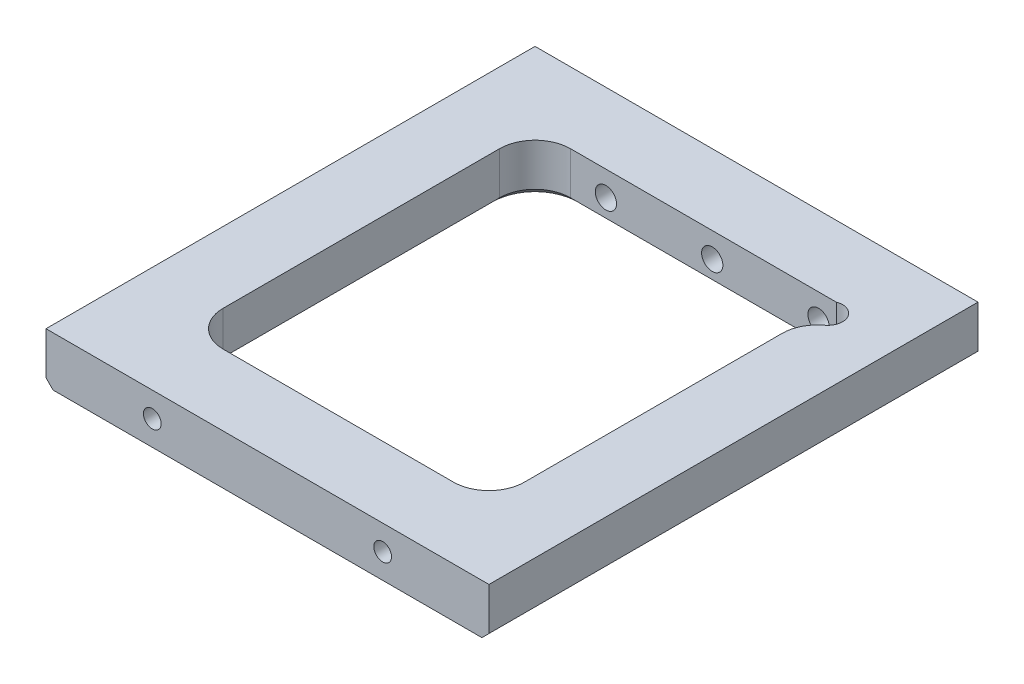
ISO-10303-21;
HEADER;
FILE_DESCRIPTION(('STEP AP214'),'2;1');
FILE_NAME('part.step','',(''),(''),'','','');
FILE_SCHEMA(('AUTOMOTIVE_DESIGN { 1 0 10303 214 1 1 1 1 }'));
ENDSEC;
DATA;
#1=APPLICATION_CONTEXT('core data for automotive mechanical design processes');
#2=APPLICATION_PROTOCOL_DEFINITION('international standard','automotive_design',2000,#1);
#3=PRODUCT_CONTEXT('',#1,'mechanical');
#4=PRODUCT('Part','Part','',(#3));
#5=PRODUCT_RELATED_PRODUCT_CATEGORY('part','',(#4));
#6=PRODUCT_DEFINITION_FORMATION('','',#4);
#7=PRODUCT_DEFINITION_CONTEXT('part definition',#1,'design');
#8=PRODUCT_DEFINITION('design','',#6,#7);
#9=PRODUCT_DEFINITION_SHAPE('','',#8);
#10=(LENGTH_UNIT() NAMED_UNIT(*) SI_UNIT(.MILLI.,.METRE.));
#11=(NAMED_UNIT(*) PLANE_ANGLE_UNIT() SI_UNIT($,.RADIAN.));
#12=(NAMED_UNIT(*) SI_UNIT($,.STERADIAN.) SOLID_ANGLE_UNIT());
#13=UNCERTAINTY_MEASURE_WITH_UNIT(LENGTH_MEASURE(1.E-05),#10,'distance_accuracy_value','');
#14=(GEOMETRIC_REPRESENTATION_CONTEXT(3) GLOBAL_UNCERTAINTY_ASSIGNED_CONTEXT((#13)) GLOBAL_UNIT_ASSIGNED_CONTEXT((#10,
#11,#12)) REPRESENTATION_CONTEXT('',''));
#15=CARTESIAN_POINT('',(0.,0.,0.));
#16=DIRECTION('',(0.,0.,1.));
#17=DIRECTION('',(1.,0.,0.));
#18=AXIS2_PLACEMENT_3D('',#15,#16,#17);
#19=CARTESIAN_POINT('',(0.,0.,0.));
#20=DIRECTION('',(0.,0.,-1.));
#21=DIRECTION('',(-1.,0.,0.));
#22=AXIS2_PLACEMENT_3D('',#19,#20,#21);
#23=PLANE('',#22);
#24=CARTESIAN_POINT('',(-25.,200.,0.));
#25=DIRECTION('',(0.,0.,-1.));
#26=DIRECTION('',(-1.,0.,0.));
#27=AXIS2_PLACEMENT_3D('',#24,#25,#26);
#28=CIRCLE('',#27,2.99999999999999);
#29=CARTESIAN_POINT('',(-28.,200.,0.));
#30=VERTEX_POINT('',#29);
#31=EDGE_CURVE('E405',#30,#30,#28,.T.);
#32=ORIENTED_EDGE('',*,*,#31,.F.);
#33=EDGE_LOOP('',(#32));
#34=FACE_BOUND('',#33,.T.);
#35=CARTESIAN_POINT('',(-55.,200.,0.));
#36=DIRECTION('',(0.,0.,-1.));
#37=DIRECTION('',(-1.,0.,0.));
#38=AXIS2_PLACEMENT_3D('',#35,#36,#37);
#39=CIRCLE('',#38,3.);
#40=CARTESIAN_POINT('',(-58.,200.,0.));
#41=VERTEX_POINT('',#40);
#42=EDGE_CURVE('E411',#41,#41,#39,.T.);
#43=ORIENTED_EDGE('',*,*,#42,.F.);
#44=EDGE_LOOP('',(#43));
#45=FACE_BOUND('',#44,.T.);
#46=CARTESIAN_POINT('',(-85.,200.,0.));
#47=DIRECTION('',(0.,0.,-1.));
#48=DIRECTION('',(-1.,0.,0.));
#49=AXIS2_PLACEMENT_3D('',#46,#47,#48);
#50=CIRCLE('',#49,3.);
#51=CARTESIAN_POINT('',(-88.,200.,0.));
#52=VERTEX_POINT('',#51);
#53=EDGE_CURVE('E417',#52,#52,#50,.T.);
#54=ORIENTED_EDGE('',*,*,#53,.F.);
#55=EDGE_LOOP('',(#54));
#56=FACE_BOUND('',#55,.T.);
#57=DIRECTION('',(0.,1.,0.));
#58=VECTOR('',#57,1.);
#59=CARTESIAN_POINT('',(0.,207.,0.));
#60=LINE('',#59,#58);
#61=CARTESIAN_POINT('',(0.,195.,0.));
#62=VERTEX_POINT('',#61);
#63=CARTESIAN_POINT('',(0.,207.,0.));
#64=VERTEX_POINT('',#63);
#65=EDGE_CURVE('E245',#62,#64,#60,.T.);
#66=ORIENTED_EDGE('',*,*,#65,.F.);
#67=DIRECTION('',(0.707106781186543,0.707106781186552,0.));
#68=VECTOR('',#67,1.);
#69=CARTESIAN_POINT('',(-97.5,97.4999999999986,0.));
#70=LINE('',#69,#68);
#71=CARTESIAN_POINT('',(-2.,193.,0.));
#72=VERTEX_POINT('',#71);
#73=EDGE_CURVE('E530',#62,#72,#70,.F.);
#74=ORIENTED_EDGE('',*,*,#73,.T.);
#75=DIRECTION('',(1.,0.,0.));
#76=VECTOR('',#75,1.);
#77=CARTESIAN_POINT('',(-125.,193.,0.));
#78=LINE('',#77,#76);
#79=CARTESIAN_POINT('',(-123.,193.,0.));
#80=VERTEX_POINT('',#79);
#81=EDGE_CURVE('E241',#80,#72,#78,.T.);
#82=ORIENTED_EDGE('',*,*,#81,.F.);
#83=DIRECTION('',(0.707106781186548,-0.707106781186548,0.));
#84=VECTOR('',#83,1.);
#85=CARTESIAN_POINT('',(35.,35.,0.));
#86=LINE('',#85,#84);
#87=CARTESIAN_POINT('',(-125.,195.,0.));
#88=VERTEX_POINT('',#87);
#89=EDGE_CURVE('E533',#80,#88,#86,.F.);
#90=ORIENTED_EDGE('',*,*,#89,.T.);
#91=DIRECTION('',(0.,-1.,0.));
#92=VECTOR('',#91,1.);
#93=CARTESIAN_POINT('',(-125.,197.5,0.));
#94=LINE('',#93,#92);
#95=CARTESIAN_POINT('',(-125.,207.,0.));
#96=VERTEX_POINT('',#95);
#97=EDGE_CURVE('E238',#96,#88,#94,.T.);
#98=ORIENTED_EDGE('',*,*,#97,.F.);
#99=DIRECTION('',(-1.,0.,0.));
#100=VECTOR('',#99,1.);
#101=CARTESIAN_POINT('',(-125.,207.,0.));
#102=LINE('',#101,#100);
#103=EDGE_CURVE('E247',#64,#96,#102,.T.);
#104=ORIENTED_EDGE('',*,*,#103,.F.);
#105=EDGE_LOOP('',(#66,#74,#82,#90,#98,#104));
#106=FACE_BOUND('',#105,.T.);
#107=ADVANCED_FACE('F43',(#34,#45,#56,#106),#23,.T.);
#108=CARTESIAN_POINT('',(-125.,207.,275.781556676645));
#109=DIRECTION('',(0.,-1.,0.));
#110=DIRECTION('',(0.,0.,-1.));
#111=AXIS2_PLACEMENT_3D('',#108,#109,#110);
#112=PLANE('',#111);
#113=CARTESIAN_POINT('',(-18.5,207.,23.9226312627786));
#114=DIRECTION('',(0.,1.,0.));
#115=DIRECTION('',(0.,0.,1.));
#116=AXIS2_PLACEMENT_3D('',#113,#114,#115);
#117=CIRCLE('',#116,4.19964713085852);
#118=CARTESIAN_POINT('',(-15.9860642462923,207.,27.2867304066741));
#119=VERTEX_POINT('',#118);
#120=CARTESIAN_POINT('',(-20.,207.,20.));
#121=VERTEX_POINT('',#120);
#122=EDGE_CURVE('E423',#119,#121,#117,.T.);
#123=ORIENTED_EDGE('',*,*,#122,.F.);
#124=CARTESIAN_POINT('',(-9.99999999999996,207.,35.2971632813233));
#125=DIRECTION('',(0.,-1.,0.));
#126=DIRECTION('',(0.,0.,-1.));
#127=AXIS2_PLACEMENT_3D('',#124,#125,#126);
#128=CIRCLE('',#127,10.);
#129=CARTESIAN_POINT('',(-20.,207.,35.2971632813233));
#130=VERTEX_POINT('',#129);
#131=EDGE_CURVE('E420',#130,#119,#128,.T.);
#132=ORIENTED_EDGE('',*,*,#131,.F.);
#133=DIRECTION('',(0.,0.,-1.));
#134=VECTOR('',#133,1.);
#135=CARTESIAN_POINT('',(-20.,207.,108.));
#136=LINE('',#135,#134);
#137=CARTESIAN_POINT('',(-20.,207.,108.));
#138=VERTEX_POINT('',#137);
#139=EDGE_CURVE('E228',#138,#130,#136,.T.);
#140=ORIENTED_EDGE('',*,*,#139,.F.);
#141=CARTESIAN_POINT('',(-30.,207.,108.));
#142=DIRECTION('',(0.,1.,0.));
#143=DIRECTION('',(0.,0.,1.));
#144=AXIS2_PLACEMENT_3D('',#141,#142,#143);
#145=CIRCLE('',#144,10.);
#146=CARTESIAN_POINT('',(-30.,207.,118.));
#147=VERTEX_POINT('',#146);
#148=EDGE_CURVE('E438',#147,#138,#145,.T.);
#149=ORIENTED_EDGE('',*,*,#148,.F.);
#150=DIRECTION('',(1.,0.,0.));
#151=VECTOR('',#150,1.);
#152=CARTESIAN_POINT('',(-95.,207.,118.));
#153=LINE('',#152,#151);
#154=CARTESIAN_POINT('',(-95.,207.,118.));
#155=VERTEX_POINT('',#154);
#156=EDGE_CURVE('E436',#155,#147,#153,.T.);
#157=ORIENTED_EDGE('',*,*,#156,.F.);
#158=CARTESIAN_POINT('',(-95.,207.,108.));
#159=DIRECTION('',(0.,1.,0.));
#160=DIRECTION('',(0.,0.,1.));
#161=AXIS2_PLACEMENT_3D('',#158,#159,#160);
#162=CIRCLE('',#161,9.99999999999999);
#163=CARTESIAN_POINT('',(-105.,207.,108.));
#164=VERTEX_POINT('',#163);
#165=EDGE_CURVE('E210',#164,#155,#162,.T.);
#166=ORIENTED_EDGE('',*,*,#165,.F.);
#167=DIRECTION('',(0.,0.,1.));
#168=VECTOR('',#167,1.);
#169=CARTESIAN_POINT('',(-105.,207.,30.0000000000001));
#170=LINE('',#169,#168);
#171=CARTESIAN_POINT('',(-105.,207.,30.0000000000001));
#172=VERTEX_POINT('',#171);
#173=EDGE_CURVE('E432',#172,#164,#170,.T.);
#174=ORIENTED_EDGE('',*,*,#173,.F.);
#175=CARTESIAN_POINT('',(-95.,207.,30.));
#176=DIRECTION('',(0.,1.,0.));
#177=DIRECTION('',(0.,0.,1.));
#178=AXIS2_PLACEMENT_3D('',#175,#176,#177);
#179=CIRCLE('',#178,10.);
#180=CARTESIAN_POINT('',(-94.9999999999999,207.,20.));
#181=VERTEX_POINT('',#180);
#182=EDGE_CURVE('E429',#181,#172,#179,.T.);
#183=ORIENTED_EDGE('',*,*,#182,.F.);
#184=DIRECTION('',(-1.,0.,0.));
#185=VECTOR('',#184,1.);
#186=CARTESIAN_POINT('',(-20.,207.,20.));
#187=LINE('',#186,#185);
#188=EDGE_CURVE('E426',#121,#181,#187,.T.);
#189=ORIENTED_EDGE('',*,*,#188,.F.);
#190=EDGE_LOOP('',(#123,#132,#140,#149,#157,#166,#174,#183,#189));
#191=FACE_BOUND('',#190,.T.);
#192=DIRECTION('',(0.,0.,-1.));
#193=VECTOR('',#192,1.);
#194=CARTESIAN_POINT('',(-125.,207.,275.781556676645));
#195=LINE('',#194,#193);
#196=CARTESIAN_POINT('',(-125.,207.,138.));
#197=VERTEX_POINT('',#196);
#198=EDGE_CURVE('E250',#197,#96,#195,.T.);
#199=ORIENTED_EDGE('',*,*,#198,.F.);
#200=DIRECTION('',(1.,0.,0.));
#201=VECTOR('',#200,1.);
#202=CARTESIAN_POINT('',(-125.,207.,138.));
#203=LINE('',#202,#201);
#204=CARTESIAN_POINT('',(0.,207.,138.));
#205=VERTEX_POINT('',#204);
#206=EDGE_CURVE('E233',#197,#205,#203,.T.);
#207=ORIENTED_EDGE('',*,*,#206,.T.);
#208=DIRECTION('',(0.,0.,-1.));
#209=VECTOR('',#208,1.);
#210=CARTESIAN_POINT('',(0.,207.,275.781556676645));
#211=LINE('',#210,#209);
#212=EDGE_CURVE('E252',#205,#64,#211,.T.);
#213=ORIENTED_EDGE('',*,*,#212,.T.);
#214=ORIENTED_EDGE('',*,*,#103,.T.);
#215=EDGE_LOOP('',(#199,#207,#213,#214));
#216=FACE_BOUND('',#215,.T.);
#217=ADVANCED_FACE('F307',(#191,#216),#112,.F.);
#218=CARTESIAN_POINT('',(0.,207.,275.781556676645));
#219=DIRECTION('',(-1.,0.,0.));
#220=DIRECTION('',(0.,0.,1.));
#221=AXIS2_PLACEMENT_3D('',#218,#219,#220);
#222=PLANE('',#221);
#223=DIRECTION('',(0.,-1.,0.));
#224=VECTOR('',#223,1.);
#225=CARTESIAN_POINT('',(0.,207.,138.));
#226=LINE('',#225,#224);
#227=CARTESIAN_POINT('',(0.,195.,138.));
#228=VERTEX_POINT('',#227);
#229=EDGE_CURVE('E229',#205,#228,#226,.T.);
#230=ORIENTED_EDGE('',*,*,#229,.T.);
#231=DIRECTION('',(0.,0.,-1.));
#232=VECTOR('',#231,1.);
#233=CARTESIAN_POINT('',(0.,195.,275.781556676645));
#234=LINE('',#233,#232);
#235=EDGE_CURVE('E195',#228,#62,#234,.T.);
#236=ORIENTED_EDGE('',*,*,#235,.T.);
#237=ORIENTED_EDGE('',*,*,#65,.T.);
#238=ORIENTED_EDGE('',*,*,#212,.F.);
#239=EDGE_LOOP('',(#230,#236,#237,#238));
#240=FACE_BOUND('',#239,.T.);
#241=ADVANCED_FACE('F313',(#240),#222,.F.);
#242=CARTESIAN_POINT('',(-125.,193.,275.781556676645));
#243=DIRECTION('',(0.,1.,0.));
#244=DIRECTION('',(0.,0.,1.));
#245=AXIS2_PLACEMENT_3D('',#242,#243,#244);
#246=PLANE('',#245);
#247=CARTESIAN_POINT('',(-9.99999999999996,193.,35.2971632813233));
#248=DIRECTION('',(0.,1.,0.));
#249=DIRECTION('',(0.,0.,1.));
#250=AXIS2_PLACEMENT_3D('',#247,#248,#249);
#251=CIRCLE('',#250,8.);
#252=CARTESIAN_POINT('',(-18.,193.,35.2971632813233));
#253=VERTEX_POINT('',#252);
#254=CARTESIAN_POINT('',(-14.7888513970338,193.,28.888816981604));
#255=VERTEX_POINT('',#254);
#256=EDGE_CURVE('E467',#253,#255,#251,.F.);
#257=ORIENTED_EDGE('',*,*,#256,.T.);
#258=CARTESIAN_POINT('',(-18.5,193.,23.9226312627786));
#259=DIRECTION('',(0.,1.,0.));
#260=DIRECTION('',(0.,0.,1.));
#261=AXIS2_PLACEMENT_3D('',#258,#259,#260);
#262=CIRCLE('',#261,6.19964713085853);
#263=CARTESIAN_POINT('',(-20.3325019706182,193.,18.));
#264=VERTEX_POINT('',#263);
#265=EDGE_CURVE('E470',#255,#264,#262,.T.);
#266=ORIENTED_EDGE('',*,*,#265,.T.);
#267=DIRECTION('',(-1.,0.,0.));
#268=VECTOR('',#267,1.);
#269=CARTESIAN_POINT('',(-125.,193.,18.));
#270=LINE('',#269,#268);
#271=CARTESIAN_POINT('',(-94.9999999999999,193.,18.));
#272=VERTEX_POINT('',#271);
#273=EDGE_CURVE('E516',#264,#272,#270,.T.);
#274=ORIENTED_EDGE('',*,*,#273,.T.);
#275=CARTESIAN_POINT('',(-95.,193.,30.));
#276=DIRECTION('',(0.,1.,0.));
#277=DIRECTION('',(0.,0.,1.));
#278=AXIS2_PLACEMENT_3D('',#275,#276,#277);
#279=CIRCLE('',#278,12.);
#280=CARTESIAN_POINT('',(-107.,193.,30.0000000000001));
#281=VERTEX_POINT('',#280);
#282=EDGE_CURVE('E513',#272,#281,#279,.T.);
#283=ORIENTED_EDGE('',*,*,#282,.T.);
#284=DIRECTION('',(0.,0.,1.));
#285=VECTOR('',#284,1.);
#286=CARTESIAN_POINT('',(-107.,193.,275.781556676645));
#287=LINE('',#286,#285);
#288=CARTESIAN_POINT('',(-107.,193.,108.));
#289=VERTEX_POINT('',#288);
#290=EDGE_CURVE('E529',#281,#289,#287,.T.);
#291=ORIENTED_EDGE('',*,*,#290,.T.);
#292=CARTESIAN_POINT('',(-95.,193.,108.));
#293=DIRECTION('',(0.,1.,0.));
#294=DIRECTION('',(0.,0.,1.));
#295=AXIS2_PLACEMENT_3D('',#292,#293,#294);
#296=CIRCLE('',#295,12.);
#297=CARTESIAN_POINT('',(-95.,193.,120.));
#298=VERTEX_POINT('',#297);
#299=EDGE_CURVE('E525',#289,#298,#296,.T.);
#300=ORIENTED_EDGE('',*,*,#299,.T.);
#301=DIRECTION('',(1.,0.,0.));
#302=VECTOR('',#301,1.);
#303=CARTESIAN_POINT('',(-125.,193.,120.));
#304=LINE('',#303,#302);
#305=CARTESIAN_POINT('',(-30.,193.,120.));
#306=VERTEX_POINT('',#305);
#307=EDGE_CURVE('E538',#298,#306,#304,.T.);
#308=ORIENTED_EDGE('',*,*,#307,.T.);
#309=CARTESIAN_POINT('',(-30.,193.,108.));
#310=DIRECTION('',(0.,1.,0.));
#311=DIRECTION('',(0.,0.,1.));
#312=AXIS2_PLACEMENT_3D('',#309,#310,#311);
#313=CIRCLE('',#312,12.);
#314=CARTESIAN_POINT('',(-18.,193.,108.));
#315=VERTEX_POINT('',#314);
#316=EDGE_CURVE('E475',#306,#315,#313,.T.);
#317=ORIENTED_EDGE('',*,*,#316,.T.);
#318=DIRECTION('',(0.,0.,-1.));
#319=VECTOR('',#318,1.);
#320=CARTESIAN_POINT('',(-18.0000000000001,193.,275.781556676645));
#321=LINE('',#320,#319);
#322=EDGE_CURVE('E471',#315,#253,#321,.T.);
#323=ORIENTED_EDGE('',*,*,#322,.T.);
#324=EDGE_LOOP('',(#257,#266,#274,#283,#291,#300,#308,#317,#323));
#325=FACE_BOUND('',#324,.T.);
#326=ORIENTED_EDGE('',*,*,#81,.T.);
#327=DIRECTION('',(0.,0.,1.));
#328=VECTOR('',#327,1.);
#329=CARTESIAN_POINT('',(-2.,193.,275.781556676645));
#330=LINE('',#329,#328);
#331=CARTESIAN_POINT('',(-2.,193.,138.));
#332=VERTEX_POINT('',#331);
#333=EDGE_CURVE('E481',#72,#332,#330,.T.);
#334=ORIENTED_EDGE('',*,*,#333,.T.);
#335=DIRECTION('',(-1.,0.,0.));
#336=VECTOR('',#335,1.);
#337=CARTESIAN_POINT('',(-125.,193.,138.));
#338=LINE('',#337,#336);
#339=CARTESIAN_POINT('',(-123.,193.,138.));
#340=VERTEX_POINT('',#339);
#341=EDGE_CURVE('E232',#332,#340,#338,.T.);
#342=ORIENTED_EDGE('',*,*,#341,.T.);
#343=DIRECTION('',(0.,0.,-1.));
#344=VECTOR('',#343,1.);
#345=CARTESIAN_POINT('',(-123.,193.,275.781556676645));
#346=LINE('',#345,#344);
#347=EDGE_CURVE('E473',#340,#80,#346,.T.);
#348=ORIENTED_EDGE('',*,*,#347,.T.);
#349=EDGE_LOOP('',(#326,#334,#342,#348));
#350=FACE_BOUND('',#349,.T.);
#351=ADVANCED_FACE('F322',(#325,#350),#246,.F.);
#352=CARTESIAN_POINT('',(-125.,197.5,275.781556676645));
#353=DIRECTION('',(1.,0.,0.));
#354=DIRECTION('',(0.,0.,-1.));
#355=AXIS2_PLACEMENT_3D('',#352,#353,#354);
#356=PLANE('',#355);
#357=ORIENTED_EDGE('',*,*,#97,.T.);
#358=DIRECTION('',(0.,0.,1.));
#359=VECTOR('',#358,1.);
#360=CARTESIAN_POINT('',(-125.,195.,275.781556676645));
#361=LINE('',#360,#359);
#362=CARTESIAN_POINT('',(-125.,195.,138.));
#363=VERTEX_POINT('',#362);
#364=EDGE_CURVE('E487',#88,#363,#361,.T.);
#365=ORIENTED_EDGE('',*,*,#364,.T.);
#366=DIRECTION('',(0.,1.,0.));
#367=VECTOR('',#366,1.);
#368=CARTESIAN_POINT('',(-125.,197.5,138.));
#369=LINE('',#368,#367);
#370=EDGE_CURVE('E236',#363,#197,#369,.T.);
#371=ORIENTED_EDGE('',*,*,#370,.T.);
#372=ORIENTED_EDGE('',*,*,#198,.T.);
#373=EDGE_LOOP('',(#357,#365,#371,#372));
#374=FACE_BOUND('',#373,.T.);
#375=ADVANCED_FACE('F326',(#374),#356,.F.);
#376=CARTESIAN_POINT('',(-128.661507045978,58.9999999719022,138.));
#377=DIRECTION('',(0.,0.,-1.));
#378=DIRECTION('',(0.,-1.,0.));
#379=AXIS2_PLACEMENT_3D('',#376,#377,#378);
#380=PLANE('',#379);
#381=CARTESIAN_POINT('',(-95.,200.,138.));
#382=DIRECTION('',(0.,0.,1.));
#383=DIRECTION('',(1.,0.,0.));
#384=AXIS2_PLACEMENT_3D('',#381,#382,#383);
#385=CIRCLE('',#384,2.49999999999999);
#386=CARTESIAN_POINT('',(-92.5,200.,138.));
#387=VERTEX_POINT('',#386);
#388=EDGE_CURVE('E206',#387,#387,#385,.T.);
#389=ORIENTED_EDGE('',*,*,#388,.F.);
#390=EDGE_LOOP('',(#389));
#391=FACE_BOUND('',#390,.T.);
#392=CARTESIAN_POINT('',(-30.,200.,138.));
#393=DIRECTION('',(0.,0.,1.));
#394=DIRECTION('',(1.,0.,0.));
#395=AXIS2_PLACEMENT_3D('',#392,#393,#394);
#396=CIRCLE('',#395,2.49999999999999);
#397=CARTESIAN_POINT('',(-27.5,200.,138.));
#398=VERTEX_POINT('',#397);
#399=EDGE_CURVE('E205',#398,#398,#396,.T.);
#400=ORIENTED_EDGE('',*,*,#399,.F.);
#401=EDGE_LOOP('',(#400));
#402=FACE_BOUND('',#401,.T.);
#403=ORIENTED_EDGE('',*,*,#341,.F.);
#404=DIRECTION('',(-0.707106781186543,-0.707106781186552,0.));
#405=VECTOR('',#404,1.);
#406=CARTESIAN_POINT('',(0.,195.,138.));
#407=LINE('',#406,#405);
#408=EDGE_CURVE('E485',#332,#228,#407,.F.);
#409=ORIENTED_EDGE('',*,*,#408,.T.);
#410=ORIENTED_EDGE('',*,*,#229,.F.);
#411=ORIENTED_EDGE('',*,*,#206,.F.);
#412=ORIENTED_EDGE('',*,*,#370,.F.);
#413=DIRECTION('',(-0.707106781186548,0.707106781186548,0.));
#414=VECTOR('',#413,1.);
#415=CARTESIAN_POINT('',(-123.,193.,138.));
#416=LINE('',#415,#414);
#417=EDGE_CURVE('E483',#363,#340,#416,.F.);
#418=ORIENTED_EDGE('',*,*,#417,.T.);
#419=EDGE_LOOP('',(#403,#409,#410,#411,#412,#418));
#420=FACE_BOUND('',#419,.T.);
#421=ADVANCED_FACE('F302',(#391,#402,#420),#380,.F.);
#422=CARTESIAN_POINT('',(-9.99999999999996,193.,35.2971632813233));
#423=DIRECTION('',(0.,1.,0.));
#424=DIRECTION('',(0.,0.,1.));
#425=AXIS2_PLACEMENT_3D('',#422,#423,#424);
#426=CYLINDRICAL_SURFACE('',#425,10.);
#427=DIRECTION('',(0.,1.,0.));
#428=VECTOR('',#427,1.);
#429=CARTESIAN_POINT('',(-15.9860642462923,193.,27.2867304066741));
#430=LINE('',#429,#428);
#431=CARTESIAN_POINT('',(-15.9860642462923,195.,27.2867304066741));
#432=VERTEX_POINT('',#431);
#433=EDGE_CURVE('E226',#432,#119,#430,.T.);
#434=ORIENTED_EDGE('',*,*,#433,.F.);
#435=CARTESIAN_POINT('',(-9.99999999999996,195.,35.2971632813233));
#436=DIRECTION('',(0.,1.,0.));
#437=DIRECTION('',(0.,0.,1.));
#438=AXIS2_PLACEMENT_3D('',#435,#436,#437);
#439=CIRCLE('',#438,10.);
#440=CARTESIAN_POINT('',(-20.,195.,35.2971632813233));
#441=VERTEX_POINT('',#440);
#442=EDGE_CURVE('E461',#432,#441,#439,.T.);
#443=ORIENTED_EDGE('',*,*,#442,.T.);
#444=DIRECTION('',(0.,1.,0.));
#445=VECTOR('',#444,1.);
#446=CARTESIAN_POINT('',(-20.,193.,35.2971632813233));
#447=LINE('',#446,#445);
#448=EDGE_CURVE('E242',#441,#130,#447,.T.);
#449=ORIENTED_EDGE('',*,*,#448,.T.);
#450=ORIENTED_EDGE('',*,*,#131,.T.);
#451=EDGE_LOOP('',(#434,#443,#449,#450));
#452=FACE_BOUND('',#451,.T.);
#453=ADVANCED_FACE('F295',(#452),#426,.T.);
#454=CARTESIAN_POINT('',(-20.,193.,108.));
#455=DIRECTION('',(1.,0.,0.));
#456=DIRECTION('',(0.,0.,-1.));
#457=AXIS2_PLACEMENT_3D('',#454,#455,#456);
#458=PLANE('',#457);
#459=ORIENTED_EDGE('',*,*,#448,.F.);
#460=DIRECTION('',(0.,0.,1.));
#461=VECTOR('',#460,1.);
#462=CARTESIAN_POINT('',(-20.,195.,108.));
#463=LINE('',#462,#461);
#464=CARTESIAN_POINT('',(-20.,195.,108.));
#465=VERTEX_POINT('',#464);
#466=EDGE_CURVE('E453',#441,#465,#463,.T.);
#467=ORIENTED_EDGE('',*,*,#466,.T.);
#468=DIRECTION('',(0.,1.,0.));
#469=VECTOR('',#468,1.);
#470=CARTESIAN_POINT('',(-20.,193.,108.));
#471=LINE('',#470,#469);
#472=EDGE_CURVE('E443',#465,#138,#471,.T.);
#473=ORIENTED_EDGE('',*,*,#472,.T.);
#474=ORIENTED_EDGE('',*,*,#139,.T.);
#475=EDGE_LOOP('',(#459,#467,#473,#474));
#476=FACE_BOUND('',#475,.T.);
#477=ADVANCED_FACE('F293',(#476),#458,.F.);
#478=CARTESIAN_POINT('',(-30.,193.,108.));
#479=DIRECTION('',(0.,1.,0.));
#480=DIRECTION('',(0.,0.,1.));
#481=AXIS2_PLACEMENT_3D('',#478,#479,#480);
#482=CYLINDRICAL_SURFACE('',#481,10.);
#483=ORIENTED_EDGE('',*,*,#472,.F.);
#484=CARTESIAN_POINT('',(-30.,195.,108.));
#485=DIRECTION('',(0.,1.,0.));
#486=DIRECTION('',(0.,0.,1.));
#487=AXIS2_PLACEMENT_3D('',#484,#485,#486);
#488=CIRCLE('',#487,10.);
#489=CARTESIAN_POINT('',(-30.,195.,118.));
#490=VERTEX_POINT('',#489);
#491=EDGE_CURVE('E460',#465,#490,#488,.F.);
#492=ORIENTED_EDGE('',*,*,#491,.T.);
#493=DIRECTION('',(0.,1.,0.));
#494=VECTOR('',#493,1.);
#495=CARTESIAN_POINT('',(-30.,193.,118.));
#496=LINE('',#495,#494);
#497=CARTESIAN_POINT('',(-30.,197.5,118.));
#498=VERTEX_POINT('',#497);
#499=EDGE_CURVE('E218',#490,#498,#496,.T.);
#500=ORIENTED_EDGE('',*,*,#499,.T.);
#501=CARTESIAN_POINT('',(-30.,197.5,118.));
#502=CARTESIAN_POINT('',(-29.9308280168792,197.499992071552,118.000006828485));
#503=CARTESIAN_POINT('',(-29.8616605925883,197.502870744777,117.999282438939));
#504=CARTESIAN_POINT('',(-29.7238407576271,197.514339788208,117.996421871753));
#505=CARTESIAN_POINT('',(-29.6551882685381,197.522929270099,117.994285913683));
#506=CARTESIAN_POINT('',(-29.5190118297973,197.545736778571,117.988658177986));
#507=CARTESIAN_POINT('',(-29.4514859842449,197.559944083099,117.985168983359));
#508=CARTESIAN_POINT('',(-29.3179261069828,197.593856024312,117.976936451667));
#509=CARTESIAN_POINT('',(-29.251892091112,197.613560719334,117.972193101295));
#510=CARTESIAN_POINT('',(-29.0567235262492,197.680708408194,117.956263916935));
#511=CARTESIAN_POINT('',(-28.930393647928,197.736206774312,117.943373270359));
#512=CARTESIAN_POINT('',(-28.6888816264023,197.866959160423,117.914424941137));
#513=CARTESIAN_POINT('',(-28.573702079602,197.942217766605,117.898366523493));
#514=CARTESIAN_POINT('',(-28.3553399952552,198.111996726011,117.864457705582));
#515=CARTESIAN_POINT('',(-28.2524163852587,198.206845189893,117.846579829748));
#516=CARTESIAN_POINT('',(-28.0637566180564,198.412412486055,117.811228254312));
#517=CARTESIAN_POINT('',(-27.9780236780696,198.523134282378,117.793754630906));
#518=CARTESIAN_POINT('',(-27.8249541965666,198.7593283443,117.760912514843));
#519=CARTESIAN_POINT('',(-27.7579096318992,198.884995174387,117.745579122207));
#520=CARTESIAN_POINT('',(-27.6460027224038,199.146254369988,117.719157669929));
#521=CARTESIAN_POINT('',(-27.6011356929472,199.281844632391,117.708068713832));
#522=CARTESIAN_POINT('',(-27.5357423360635,199.556237614926,117.691674704828));
#523=CARTESIAN_POINT('',(-27.5147467009528,199.694921681028,117.68625830511));
#524=CARTESIAN_POINT('',(-27.4962303130459,199.973944438348,117.681489360611));
#525=CARTESIAN_POINT('',(-27.4987062708209,200.114282894958,117.682135966128));
#526=CARTESIAN_POINT('',(-27.5266891871176,200.389026957086,117.689320107798));
#527=CARTESIAN_POINT('',(-27.5516363159903,200.523493911289,117.695714441416));
#528=CARTESIAN_POINT('',(-27.6229601133262,200.786269571383,117.713445262522));
#529=CARTESIAN_POINT('',(-27.6693381165062,200.914577893165,117.724782057824));
#530=CARTESIAN_POINT('',(-27.7826848380056,201.162898157853,117.751252055304));
#531=CARTESIAN_POINT('',(-27.8498570037319,201.282813101022,117.766422483243));
#532=CARTESIAN_POINT('',(-28.002741694207,201.509867052791,117.798828919381));
#533=CARTESIAN_POINT('',(-28.0884570282275,201.617004121735,117.816065240383));
#534=CARTESIAN_POINT('',(-28.2788828433389,201.818661079089,117.851262658283));
#535=CARTESIAN_POINT('',(-28.3840637936875,201.912736039553,117.869230434136));
#536=CARTESIAN_POINT('',(-28.608954834665,202.082018399562,117.903429048566));
#537=CARTESIAN_POINT('',(-28.7286686509497,202.157220945742,117.91965943973));
#538=CARTESIAN_POINT('',(-28.9798803175335,202.28679216829,117.948638232564));
#539=CARTESIAN_POINT('',(-29.111422988102,202.34107709837,117.96137258011));
#540=CARTESIAN_POINT('',(-29.3820788076658,202.426570468737,117.981808295472));
#541=CARTESIAN_POINT('',(-29.5211805459468,202.457812707998,117.989517032909));
#542=CARTESIAN_POINT('',(-29.7179030401037,202.484681075646,117.996179445306));
#543=CARTESIAN_POINT('',(-29.7742072759816,202.490426782057,117.997610251743));
#544=CARTESIAN_POINT('',(-29.8869987733738,202.498081882109,117.999520009604));
#545=CARTESIAN_POINT('',(-29.9434855802572,202.499997583298,118.000000526027));
#546=CARTESIAN_POINT('',(-30.,202.5,118.));
#547=B_SPLINE_CURVE_WITH_KNOTS('',3,(#501,#502,#503,#504,#505,#506,#507,#508,#509,#510,#511,
#512,#513,#514,#515,#516,#517,#518,#519,#520,#521,#522,#523,#524,#525,#526,#527,#528,#529,#530,
#531,#532,#533,#534,#535,#536,#537,#538,#539,#540,#541,#542,#543,#544,#545,#546),.UNSPECIFIED.,
.F.,.F.,(4,2,2,2,2,2,2,2,2,2,2,2,2,2,2,2,2,2,2,2,2,2,4),(0.,0.207444392168178,0.414856523930364,
0.621874689521049,0.828895052029221,1.24254842673381,1.65629789193883,2.07763963139775,
2.49906015115031,2.92673643717074,3.3543223451762,3.77334818145838,4.1923152941904,
4.60112477334777,5.00995971663054,5.4229283071678,5.83595950590654,6.26072493222843,
6.6855994825847,7.11215782224385,7.53808923584225,7.70782285938568,7.87727672149714),.UNSPECIFIED.);
#548=CARTESIAN_POINT('',(-30.,202.5,118.));
#549=VERTEX_POINT('',#548);
#550=EDGE_CURVE('E196',#498,#549,#547,.T.);
#551=ORIENTED_EDGE('',*,*,#550,.T.);
#552=EDGE_CURVE('E214',#549,#147,#496,.T.);
#553=ORIENTED_EDGE('',*,*,#552,.T.);
#554=ORIENTED_EDGE('',*,*,#148,.T.);
#555=EDGE_LOOP('',(#483,#492,#500,#551,#553,#554));
#556=FACE_BOUND('',#555,.T.);
#557=ADVANCED_FACE('F271',(#556),#482,.F.);
#558=CARTESIAN_POINT('',(-95.,193.,118.));
#559=DIRECTION('',(0.,0.,1.));
#560=DIRECTION('',(1.,0.,0.));
#561=AXIS2_PLACEMENT_3D('',#558,#559,#560);
#562=PLANE('',#561);
#563=ORIENTED_EDGE('',*,*,#499,.F.);
#564=DIRECTION('',(-1.,0.,0.));
#565=VECTOR('',#564,1.);
#566=CARTESIAN_POINT('',(-95.,195.,118.));
#567=LINE('',#566,#565);
#568=CARTESIAN_POINT('',(-95.,195.,118.));
#569=VERTEX_POINT('',#568);
#570=EDGE_CURVE('E495',#490,#569,#567,.T.);
#571=ORIENTED_EDGE('',*,*,#570,.T.);
#572=DIRECTION('',(0.,1.,0.));
#573=VECTOR('',#572,1.);
#574=CARTESIAN_POINT('',(-95.,193.,118.));
#575=LINE('',#574,#573);
#576=CARTESIAN_POINT('',(-95.,197.5,118.));
#577=VERTEX_POINT('',#576);
#578=EDGE_CURVE('E204',#569,#577,#575,.T.);
#579=ORIENTED_EDGE('',*,*,#578,.T.);
#580=CARTESIAN_POINT('',(-95.,200.,118.));
#581=DIRECTION('',(0.,0.,1.));
#582=DIRECTION('',(1.,0.,0.));
#583=AXIS2_PLACEMENT_3D('',#580,#581,#582);
#584=CIRCLE('',#583,2.5);
#585=CARTESIAN_POINT('',(-95.,202.5,118.));
#586=VERTEX_POINT('',#585);
#587=EDGE_CURVE('E193',#577,#586,#584,.T.);
#588=ORIENTED_EDGE('',*,*,#587,.T.);
#589=EDGE_CURVE('E202',#586,#155,#575,.T.);
#590=ORIENTED_EDGE('',*,*,#589,.T.);
#591=ORIENTED_EDGE('',*,*,#156,.T.);
#592=ORIENTED_EDGE('',*,*,#552,.F.);
#593=CARTESIAN_POINT('',(-30.,200.,118.));
#594=DIRECTION('',(0.,0.,1.));
#595=DIRECTION('',(1.,0.,0.));
#596=AXIS2_PLACEMENT_3D('',#593,#594,#595);
#597=CIRCLE('',#596,2.49999999999999);
#598=EDGE_CURVE('E399',#549,#498,#597,.T.);
#599=ORIENTED_EDGE('',*,*,#598,.T.);
#600=EDGE_LOOP('',(#563,#571,#579,#588,#590,#591,#592,#599));
#601=FACE_BOUND('',#600,.T.);
#602=ADVANCED_FACE('F200',(#601),#562,.F.);
#603=CARTESIAN_POINT('',(-95.,193.,108.));
#604=DIRECTION('',(0.,1.,0.));
#605=DIRECTION('',(0.,0.,1.));
#606=AXIS2_PLACEMENT_3D('',#603,#604,#605);
#607=CYLINDRICAL_SURFACE('',#606,9.99999999999999);
#608=ORIENTED_EDGE('',*,*,#578,.F.);
#609=CARTESIAN_POINT('',(-95.,195.,108.));
#610=DIRECTION('',(0.,1.,0.));
#611=DIRECTION('',(0.,0.,1.));
#612=AXIS2_PLACEMENT_3D('',#609,#610,#611);
#613=CIRCLE('',#612,9.99999999999999);
#614=CARTESIAN_POINT('',(-105.,195.,108.));
#615=VERTEX_POINT('',#614);
#616=EDGE_CURVE('E53',#569,#615,#613,.F.);
#617=ORIENTED_EDGE('',*,*,#616,.T.);
#618=DIRECTION('',(0.,1.,0.));
#619=VECTOR('',#618,1.);
#620=CARTESIAN_POINT('',(-105.,193.,108.));
#621=LINE('',#620,#619);
#622=EDGE_CURVE('E212',#615,#164,#621,.T.);
#623=ORIENTED_EDGE('',*,*,#622,.T.);
#624=ORIENTED_EDGE('',*,*,#165,.T.);
#625=ORIENTED_EDGE('',*,*,#589,.F.);
#626=CARTESIAN_POINT('',(-95.,202.5,118.));
#627=CARTESIAN_POINT('',(-95.0691719831208,202.500007928448,118.000006828485));
#628=CARTESIAN_POINT('',(-95.1383394074117,202.497129255223,117.999282438939));
#629=CARTESIAN_POINT('',(-95.2761592423729,202.485660211792,117.996421871753));
#630=CARTESIAN_POINT('',(-95.3448117314619,202.477070729901,117.994285913683));
#631=CARTESIAN_POINT('',(-95.4809881702027,202.454263221429,117.988658177986));
#632=CARTESIAN_POINT('',(-95.5485140157551,202.440055916901,117.985168983359));
#633=CARTESIAN_POINT('',(-95.6820738930172,202.406143975688,117.976936451667));
#634=CARTESIAN_POINT('',(-95.748107908888,202.386439280666,117.972193101295));
#635=CARTESIAN_POINT('',(-95.9432764737508,202.319291591806,117.956263916935));
#636=CARTESIAN_POINT('',(-96.069606352072,202.263793225688,117.943373270359));
#637=CARTESIAN_POINT('',(-96.3111183735977,202.133040839576,117.914424941137));
#638=CARTESIAN_POINT('',(-96.426297920398,202.057782233395,117.898366523493));
#639=CARTESIAN_POINT('',(-96.6446600047448,201.888003273989,117.864457705582));
#640=CARTESIAN_POINT('',(-96.7475836147413,201.793154810107,117.846579829748));
#641=CARTESIAN_POINT('',(-96.9362433819436,201.587587513945,117.811228254312));
#642=CARTESIAN_POINT('',(-97.0219763219304,201.476865717622,117.793754630906));
#643=CARTESIAN_POINT('',(-97.1750458034334,201.2406716557,117.760912514843));
#644=CARTESIAN_POINT('',(-97.2420903681008,201.115004825613,117.745579122207));
#645=CARTESIAN_POINT('',(-97.3539972775962,200.853745630012,117.719157669929));
#646=CARTESIAN_POINT('',(-97.3988643070528,200.718155367609,117.708068713832));
#647=CARTESIAN_POINT('',(-97.4642576639365,200.443762385074,117.691674704828));
#648=CARTESIAN_POINT('',(-97.4852532990472,200.305078318972,117.68625830511));
#649=CARTESIAN_POINT('',(-97.5037696869541,200.026055561652,117.681489360611));
#650=CARTESIAN_POINT('',(-97.5012937291791,199.885717105042,117.682135966128));
#651=CARTESIAN_POINT('',(-97.4733108128824,199.610973042914,117.689320107798));
#652=CARTESIAN_POINT('',(-97.4483636840097,199.476506088711,117.695714441416));
#653=CARTESIAN_POINT('',(-97.3770398866738,199.213730428617,117.713445262522));
#654=CARTESIAN_POINT('',(-97.3306618834938,199.085422106835,117.724782057824));
#655=CARTESIAN_POINT('',(-97.2173151619944,198.837101842147,117.751252055304));
#656=CARTESIAN_POINT('',(-97.1501429962681,198.717186898978,117.766422483243));
#657=CARTESIAN_POINT('',(-96.997258305793,198.490132947209,117.798828919381));
#658=CARTESIAN_POINT('',(-96.9115429717725,198.382995878265,117.816065240383));
#659=CARTESIAN_POINT('',(-96.7211171566611,198.181338920911,117.851262658283));
#660=CARTESIAN_POINT('',(-96.6159362063126,198.087263960447,117.869230434136));
#661=CARTESIAN_POINT('',(-96.391045165335,197.917981600438,117.903429048566));
#662=CARTESIAN_POINT('',(-96.2713313490503,197.842779054258,117.91965943973));
#663=CARTESIAN_POINT('',(-96.0201196824665,197.71320783171,117.948638232564));
#664=CARTESIAN_POINT('',(-95.888577011898,197.65892290163,117.96137258011));
#665=CARTESIAN_POINT('',(-95.6179211923342,197.573429531262,117.981808295472));
#666=CARTESIAN_POINT('',(-95.4788194540532,197.542187292002,117.989517032909));
#667=CARTESIAN_POINT('',(-95.2820969598962,197.515318924354,117.996179445306));
#668=CARTESIAN_POINT('',(-95.2257927240184,197.509573217943,117.997610251743));
#669=CARTESIAN_POINT('',(-95.1130012266262,197.501918117891,117.999520009604));
#670=CARTESIAN_POINT('',(-95.0565144197428,197.500002416702,118.000000526027));
#671=CARTESIAN_POINT('',(-95.,197.5,118.));
#672=B_SPLINE_CURVE_WITH_KNOTS('',3,(#626,#627,#628,#629,#630,#631,#632,#633,#634,#635,#636,
#637,#638,#639,#640,#641,#642,#643,#644,#645,#646,#647,#648,#649,#650,#651,#652,#653,#654,#655,
#656,#657,#658,#659,#660,#661,#662,#663,#664,#665,#666,#667,#668,#669,#670,#671),.UNSPECIFIED.,
.F.,.F.,(4,2,2,2,2,2,2,2,2,2,2,2,2,2,2,2,2,2,2,2,2,2,4),(0.,0.207444392168171,0.414856523930354,
0.621874689521061,0.828895052029226,1.24254842673381,1.65629789193884,2.0776396313978,
2.49906015115032,2.92673643717075,3.35432234517621,3.77334818145839,4.19231529419041,
4.60112477334779,5.00995971663055,5.42292830716781,5.83595950590655,6.26072493222843,
6.68559948258471,7.11215782224388,7.53808923584229,7.70782285938571,7.87727672149716),.UNSPECIFIED.);
#673=EDGE_CURVE('E190',#586,#577,#672,.T.);
#674=ORIENTED_EDGE('',*,*,#673,.T.);
#675=EDGE_LOOP('',(#608,#617,#623,#624,#625,#674));
#676=FACE_BOUND('',#675,.T.);
#677=ADVANCED_FACE('F208',(#676),#607,.F.);
#678=CARTESIAN_POINT('',(-105.,193.,30.0000000000001));
#679=DIRECTION('',(-1.,0.,0.));
#680=DIRECTION('',(0.,0.,1.));
#681=AXIS2_PLACEMENT_3D('',#678,#679,#680);
#682=PLANE('',#681);
#683=ORIENTED_EDGE('',*,*,#622,.F.);
#684=DIRECTION('',(0.,0.,-1.));
#685=VECTOR('',#684,1.);
#686=CARTESIAN_POINT('',(-105.,195.,30.0000000000001));
#687=LINE('',#686,#685);
#688=CARTESIAN_POINT('',(-105.,195.,30.0000000000001));
#689=VERTEX_POINT('',#688);
#690=EDGE_CURVE('E11',#615,#689,#687,.T.);
#691=ORIENTED_EDGE('',*,*,#690,.T.);
#692=DIRECTION('',(0.,1.,0.));
#693=VECTOR('',#692,1.);
#694=CARTESIAN_POINT('',(-105.,193.,30.0000000000001));
#695=LINE('',#694,#693);
#696=EDGE_CURVE('E215',#689,#172,#695,.T.);
#697=ORIENTED_EDGE('',*,*,#696,.T.);
#698=ORIENTED_EDGE('',*,*,#173,.T.);
#699=EDGE_LOOP('',(#683,#691,#697,#698));
#700=FACE_BOUND('',#699,.T.);
#701=ADVANCED_FACE('F522',(#700),#682,.F.);
#702=CARTESIAN_POINT('',(-95.,193.,30.));
#703=DIRECTION('',(0.,1.,0.));
#704=DIRECTION('',(0.,0.,1.));
#705=AXIS2_PLACEMENT_3D('',#702,#703,#704);
#706=CYLINDRICAL_SURFACE('',#705,10.);
#707=ORIENTED_EDGE('',*,*,#696,.F.);
#708=CARTESIAN_POINT('',(-95.,195.,30.));
#709=DIRECTION('',(0.,1.,0.));
#710=DIRECTION('',(0.,0.,1.));
#711=AXIS2_PLACEMENT_3D('',#708,#709,#710);
#712=CIRCLE('',#711,10.);
#713=CARTESIAN_POINT('',(-94.9999999999999,195.,20.));
#714=VERTEX_POINT('',#713);
#715=EDGE_CURVE('E497',#689,#714,#712,.F.);
#716=ORIENTED_EDGE('',*,*,#715,.T.);
#717=DIRECTION('',(0.,1.,0.));
#718=VECTOR('',#717,1.);
#719=CARTESIAN_POINT('',(-94.9999999999999,193.,20.));
#720=LINE('',#719,#718);
#721=EDGE_CURVE('E222',#714,#181,#720,.T.);
#722=ORIENTED_EDGE('',*,*,#721,.T.);
#723=ORIENTED_EDGE('',*,*,#182,.T.);
#724=EDGE_LOOP('',(#707,#716,#722,#723));
#725=FACE_BOUND('',#724,.T.);
#726=ADVANCED_FACE('F501',(#725),#706,.F.);
#727=CARTESIAN_POINT('',(-20.,193.,20.));
#728=DIRECTION('',(0.,0.,-1.));
#729=DIRECTION('',(-1.,0.,0.));
#730=AXIS2_PLACEMENT_3D('',#727,#728,#729);
#731=PLANE('',#730);
#732=CARTESIAN_POINT('',(-25.,200.,20.));
#733=DIRECTION('',(0.,0.,1.));
#734=DIRECTION('',(1.,0.,0.));
#735=AXIS2_PLACEMENT_3D('',#732,#733,#734);
#736=CIRCLE('',#735,3.);
#737=CARTESIAN_POINT('',(-22.,200.,20.));
#738=VERTEX_POINT('',#737);
#739=EDGE_CURVE('E402',#738,#738,#736,.T.);
#740=ORIENTED_EDGE('',*,*,#739,.F.);
#741=EDGE_LOOP('',(#740));
#742=FACE_BOUND('',#741,.T.);
#743=CARTESIAN_POINT('',(-55.,200.,20.));
#744=DIRECTION('',(0.,0.,1.));
#745=DIRECTION('',(1.,0.,0.));
#746=AXIS2_PLACEMENT_3D('',#743,#744,#745);
#747=CIRCLE('',#746,3.);
#748=CARTESIAN_POINT('',(-52.,200.,20.));
#749=VERTEX_POINT('',#748);
#750=EDGE_CURVE('E408',#749,#749,#747,.T.);
#751=ORIENTED_EDGE('',*,*,#750,.F.);
#752=EDGE_LOOP('',(#751));
#753=FACE_BOUND('',#752,.T.);
#754=CARTESIAN_POINT('',(-85.,200.,20.));
#755=DIRECTION('',(0.,0.,1.));
#756=DIRECTION('',(1.,0.,0.));
#757=AXIS2_PLACEMENT_3D('',#754,#755,#756);
#758=CIRCLE('',#757,3.);
#759=CARTESIAN_POINT('',(-82.,200.,20.));
#760=VERTEX_POINT('',#759);
#761=EDGE_CURVE('E414',#760,#760,#758,.T.);
#762=ORIENTED_EDGE('',*,*,#761,.F.);
#763=EDGE_LOOP('',(#762));
#764=FACE_BOUND('',#763,.T.);
#765=ORIENTED_EDGE('',*,*,#721,.F.);
#766=DIRECTION('',(1.,0.,0.));
#767=VECTOR('',#766,1.);
#768=CARTESIAN_POINT('',(-20.,195.,20.));
#769=LINE('',#768,#767);
#770=CARTESIAN_POINT('',(-20.,195.,20.));
#771=VERTEX_POINT('',#770);
#772=EDGE_CURVE('E493',#714,#771,#769,.T.);
#773=ORIENTED_EDGE('',*,*,#772,.T.);
#774=DIRECTION('',(0.,1.,0.));
#775=VECTOR('',#774,1.);
#776=CARTESIAN_POINT('',(-20.,193.,20.));
#777=LINE('',#776,#775);
#778=EDGE_CURVE('E224',#771,#121,#777,.T.);
#779=ORIENTED_EDGE('',*,*,#778,.T.);
#780=ORIENTED_EDGE('',*,*,#188,.T.);
#781=EDGE_LOOP('',(#765,#773,#779,#780));
#782=FACE_BOUND('',#781,.T.);
#783=ADVANCED_FACE('F506',(#742,#753,#764,#782),#731,.F.);
#784=CARTESIAN_POINT('',(-18.5,193.,23.9226312627786));
#785=DIRECTION('',(0.,1.,0.));
#786=DIRECTION('',(0.,0.,1.));
#787=AXIS2_PLACEMENT_3D('',#784,#785,#786);
#788=CYLINDRICAL_SURFACE('',#787,4.19964713085852);
#789=ORIENTED_EDGE('',*,*,#778,.F.);
#790=CARTESIAN_POINT('',(-18.5,195.,23.9226312627786));
#791=DIRECTION('',(0.,1.,0.));
#792=DIRECTION('',(0.,0.,1.));
#793=AXIS2_PLACEMENT_3D('',#790,#791,#792);
#794=CIRCLE('',#793,4.19964713085852);
#795=EDGE_CURVE('E489',#771,#432,#794,.F.);
#796=ORIENTED_EDGE('',*,*,#795,.T.);
#797=ORIENTED_EDGE('',*,*,#433,.T.);
#798=ORIENTED_EDGE('',*,*,#122,.T.);
#799=EDGE_LOOP('',(#789,#796,#797,#798));
#800=FACE_BOUND('',#799,.T.);
#801=ADVANCED_FACE('F291',(#800),#788,.F.);
#802=CARTESIAN_POINT('',(-85.,200.,20.));
#803=DIRECTION('',(0.,0.,1.));
#804=DIRECTION('',(1.,0.,0.));
#805=AXIS2_PLACEMENT_3D('',#802,#803,#804);
#806=CYLINDRICAL_SURFACE('',#805,3.);
#807=ORIENTED_EDGE('',*,*,#53,.T.);
#808=EDGE_LOOP('',(#807));
#809=FACE_BOUND('',#808,.T.);
#810=ORIENTED_EDGE('',*,*,#761,.T.);
#811=EDGE_LOOP('',(#810));
#812=FACE_BOUND('',#811,.T.);
#813=ADVANCED_FACE('F288',(#809,#812),#806,.F.);
#814=CARTESIAN_POINT('',(-55.,200.,20.));
#815=DIRECTION('',(0.,0.,1.));
#816=DIRECTION('',(1.,0.,0.));
#817=AXIS2_PLACEMENT_3D('',#814,#815,#816);
#818=CYLINDRICAL_SURFACE('',#817,3.);
#819=ORIENTED_EDGE('',*,*,#42,.T.);
#820=EDGE_LOOP('',(#819));
#821=FACE_BOUND('',#820,.T.);
#822=ORIENTED_EDGE('',*,*,#750,.T.);
#823=EDGE_LOOP('',(#822));
#824=FACE_BOUND('',#823,.T.);
#825=ADVANCED_FACE('F284',(#821,#824),#818,.F.);
#826=CARTESIAN_POINT('',(-25.,200.,20.));
#827=DIRECTION('',(0.,0.,1.));
#828=DIRECTION('',(1.,0.,0.));
#829=AXIS2_PLACEMENT_3D('',#826,#827,#828);
#830=CYLINDRICAL_SURFACE('',#829,2.99999999999999);
#831=ORIENTED_EDGE('',*,*,#31,.T.);
#832=EDGE_LOOP('',(#831));
#833=FACE_BOUND('',#832,.T.);
#834=ORIENTED_EDGE('',*,*,#739,.T.);
#835=EDGE_LOOP('',(#834));
#836=FACE_BOUND('',#835,.T.);
#837=ADVANCED_FACE('F279',(#833,#836),#830,.F.);
#838=CARTESIAN_POINT('',(-30.,200.,138.));
#839=DIRECTION('',(0.,0.,1.));
#840=DIRECTION('',(1.,0.,0.));
#841=AXIS2_PLACEMENT_3D('',#838,#839,#840);
#842=CYLINDRICAL_SURFACE('',#841,2.49999999999999);
#843=ORIENTED_EDGE('',*,*,#399,.T.);
#844=EDGE_LOOP('',(#843));
#845=FACE_BOUND('',#844,.T.);
#846=ORIENTED_EDGE('',*,*,#550,.F.);
#847=ORIENTED_EDGE('',*,*,#598,.F.);
#848=EDGE_LOOP('',(#846,#847));
#849=FACE_BOUND('',#848,.T.);
#850=ADVANCED_FACE('F275',(#845,#849),#842,.F.);
#851=CARTESIAN_POINT('',(-95.,200.,138.));
#852=DIRECTION('',(0.,0.,1.));
#853=DIRECTION('',(1.,0.,0.));
#854=AXIS2_PLACEMENT_3D('',#851,#852,#853);
#855=CYLINDRICAL_SURFACE('',#854,2.5);
#856=ORIENTED_EDGE('',*,*,#388,.T.);
#857=EDGE_LOOP('',(#856));
#858=FACE_BOUND('',#857,.T.);
#859=ORIENTED_EDGE('',*,*,#673,.F.);
#860=ORIENTED_EDGE('',*,*,#587,.F.);
#861=EDGE_LOOP('',(#859,#860));
#862=FACE_BOUND('',#861,.T.);
#863=ADVANCED_FACE('F192',(#858,#862),#855,.F.);
#864=CARTESIAN_POINT('',(0.,195.,275.781556676645));
#865=DIRECTION('',(-0.707106781186552,0.707106781186542,0.));
#866=DIRECTION('',(0.,0.,-1.));
#867=AXIS2_PLACEMENT_3D('',#864,#865,#866);
#868=PLANE('',#867);
#869=ORIENTED_EDGE('',*,*,#408,.F.);
#870=ORIENTED_EDGE('',*,*,#333,.F.);
#871=ORIENTED_EDGE('',*,*,#73,.F.);
#872=ORIENTED_EDGE('',*,*,#235,.F.);
#873=EDGE_LOOP('',(#869,#870,#871,#872));
#874=FACE_BOUND('',#873,.T.);
#875=ADVANCED_FACE('F332',(#874),#868,.F.);
#876=CARTESIAN_POINT('',(-123.,193.,275.781556676645));
#877=DIRECTION('',(0.707106781186547,0.707106781186547,0.));
#878=DIRECTION('',(0.,0.,-1.));
#879=AXIS2_PLACEMENT_3D('',#876,#877,#878);
#880=PLANE('',#879);
#881=ORIENTED_EDGE('',*,*,#417,.F.);
#882=ORIENTED_EDGE('',*,*,#364,.F.);
#883=ORIENTED_EDGE('',*,*,#89,.F.);
#884=ORIENTED_EDGE('',*,*,#347,.F.);
#885=EDGE_LOOP('',(#881,#882,#883,#884));
#886=FACE_BOUND('',#885,.T.);
#887=ADVANCED_FACE('F338',(#886),#880,.F.);
#888=CARTESIAN_POINT('',(-125.,193.,120.));
#889=DIRECTION('',(0.,0.707106781186545,0.70710678118655));
#890=DIRECTION('',(1.,0.,0.));
#891=AXIS2_PLACEMENT_3D('',#888,#889,#890);
#892=PLANE('',#891);
#893=DIRECTION('',(0.,0.70710678118655,-0.707106781186545));
#894=VECTOR('',#893,1.);
#895=CARTESIAN_POINT('',(-30.,193.,120.));
#896=LINE('',#895,#894);
#897=EDGE_CURVE('E382',#306,#490,#896,.T.);
#898=ORIENTED_EDGE('',*,*,#897,.F.);
#899=ORIENTED_EDGE('',*,*,#307,.F.);
#900=DIRECTION('',(0.,-0.70710678118655,0.707106781186545));
#901=VECTOR('',#900,1.);
#902=CARTESIAN_POINT('',(-95.,195.,118.));
#903=LINE('',#902,#901);
#904=EDGE_CURVE('E48',#569,#298,#903,.T.);
#905=ORIENTED_EDGE('',*,*,#904,.F.);
#906=ORIENTED_EDGE('',*,*,#570,.F.);
#907=EDGE_LOOP('',(#898,#899,#905,#906));
#908=FACE_BOUND('',#907,.T.);
#909=ADVANCED_FACE('F46',(#908),#892,.F.);
#910=CARTESIAN_POINT('',(-95.,193.,108.));
#911=DIRECTION('',(0.,-1.,0.));
#912=DIRECTION('',(0.,0.,-1.));
#913=AXIS2_PLACEMENT_3D('',#910,#911,#912);
#914=CONICAL_SURFACE('',#913,12.,0.785398163397441);
#915=ORIENTED_EDGE('',*,*,#904,.T.);
#916=ORIENTED_EDGE('',*,*,#299,.F.);
#917=DIRECTION('',(-0.707106781186542,-0.707106781186552,0.));
#918=VECTOR('',#917,1.);
#919=CARTESIAN_POINT('',(-105.,195.,108.));
#920=LINE('',#919,#918);
#921=EDGE_CURVE('E380',#615,#289,#920,.T.);
#922=ORIENTED_EDGE('',*,*,#921,.F.);
#923=ORIENTED_EDGE('',*,*,#616,.F.);
#924=EDGE_LOOP('',(#915,#916,#922,#923));
#925=FACE_BOUND('',#924,.T.);
#926=ADVANCED_FACE('F524',(#925),#914,.F.);
#927=CARTESIAN_POINT('',(-30.,193.,108.));
#928=DIRECTION('',(0.,-1.,0.));
#929=DIRECTION('',(0.,0.,-1.));
#930=AXIS2_PLACEMENT_3D('',#927,#928,#929);
#931=CONICAL_SURFACE('',#930,12.,0.785398163397441);
#932=ORIENTED_EDGE('',*,*,#897,.T.);
#933=ORIENTED_EDGE('',*,*,#491,.F.);
#934=DIRECTION('',(-0.707106781186542,0.707106781186553,0.));
#935=VECTOR('',#934,1.);
#936=CARTESIAN_POINT('',(-18.,193.,108.));
#937=LINE('',#936,#935);
#938=EDGE_CURVE('E377',#315,#465,#937,.T.);
#939=ORIENTED_EDGE('',*,*,#938,.F.);
#940=ORIENTED_EDGE('',*,*,#316,.F.);
#941=EDGE_LOOP('',(#932,#933,#939,#940));
#942=FACE_BOUND('',#941,.T.);
#943=ADVANCED_FACE('F542',(#942),#931,.F.);
#944=CARTESIAN_POINT('',(-107.,193.,275.781556676645));
#945=DIRECTION('',(-0.707106781186551,0.707106781186544,0.));
#946=DIRECTION('',(0.,0.,1.));
#947=AXIS2_PLACEMENT_3D('',#944,#945,#946);
#948=PLANE('',#947);
#949=ORIENTED_EDGE('',*,*,#921,.T.);
#950=ORIENTED_EDGE('',*,*,#290,.F.);
#951=DIRECTION('',(-0.707106781186545,-0.70710678118655,0.));
#952=VECTOR('',#951,1.);
#953=CARTESIAN_POINT('',(-105.,195.,30.0000000000001));
#954=LINE('',#953,#952);
#955=EDGE_CURVE('E374',#689,#281,#954,.T.);
#956=ORIENTED_EDGE('',*,*,#955,.F.);
#957=ORIENTED_EDGE('',*,*,#690,.F.);
#958=EDGE_LOOP('',(#949,#950,#956,#957));
#959=FACE_BOUND('',#958,.T.);
#960=ADVANCED_FACE('F528',(#959),#948,.F.);
#961=CARTESIAN_POINT('',(-18.0000000000001,193.,275.781556676645));
#962=DIRECTION('',(0.707106781186554,0.707106781186541,0.));
#963=DIRECTION('',(0.,0.,-1.));
#964=AXIS2_PLACEMENT_3D('',#961,#962,#963);
#965=PLANE('',#964);
#966=ORIENTED_EDGE('',*,*,#938,.T.);
#967=ORIENTED_EDGE('',*,*,#466,.F.);
#968=DIRECTION('',(-0.707106781186541,0.707106781186554,0.));
#969=VECTOR('',#968,1.);
#970=CARTESIAN_POINT('',(-18.,193.,35.2971632813233));
#971=LINE('',#970,#969);
#972=EDGE_CURVE('E371',#253,#441,#971,.T.);
#973=ORIENTED_EDGE('',*,*,#972,.F.);
#974=ORIENTED_EDGE('',*,*,#322,.F.);
#975=EDGE_LOOP('',(#966,#967,#973,#974));
#976=FACE_BOUND('',#975,.T.);
#977=ADVANCED_FACE('F456',(#976),#965,.F.);
#978=CARTESIAN_POINT('',(-95.,193.,30.));
#979=DIRECTION('',(0.,-1.,0.));
#980=DIRECTION('',(0.,0.,-1.));
#981=AXIS2_PLACEMENT_3D('',#978,#979,#980);
#982=CONICAL_SURFACE('',#981,12.,0.785398163397441);
#983=ORIENTED_EDGE('',*,*,#955,.T.);
#984=ORIENTED_EDGE('',*,*,#282,.F.);
#985=DIRECTION('',(0.,-0.707106781186553,-0.707106781186542));
#986=VECTOR('',#985,1.);
#987=CARTESIAN_POINT('',(-94.9999999999999,195.,20.));
#988=LINE('',#987,#986);
#989=EDGE_CURVE('E368',#714,#272,#988,.T.);
#990=ORIENTED_EDGE('',*,*,#989,.F.);
#991=ORIENTED_EDGE('',*,*,#715,.F.);
#992=EDGE_LOOP('',(#983,#984,#990,#991));
#993=FACE_BOUND('',#992,.T.);
#994=ADVANCED_FACE('F512',(#993),#982,.F.);
#995=CARTESIAN_POINT('',(-9.99999999999996,193.,35.2971632813233));
#996=DIRECTION('',(0.,1.,0.));
#997=DIRECTION('',(0.,0.,1.));
#998=AXIS2_PLACEMENT_3D('',#995,#996,#997);
#999=CONICAL_SURFACE('',#998,8.,0.785398163397441);
#1000=ORIENTED_EDGE('',*,*,#972,.T.);
#1001=ORIENTED_EDGE('',*,*,#442,.F.);
#1002=DIRECTION('',(-0.423278662117164,0.707106781186553,-0.566423140590404));
#1003=VECTOR('',#1002,1.);
#1004=CARTESIAN_POINT('',(-14.7888513970338,193.,28.888816981604));
#1005=LINE('',#1004,#1003);
#1006=EDGE_CURVE('E365',#255,#432,#1005,.T.);
#1007=ORIENTED_EDGE('',*,*,#1006,.F.);
#1008=ORIENTED_EDGE('',*,*,#256,.F.);
#1009=EDGE_LOOP('',(#1000,#1001,#1007,#1008));
#1010=FACE_BOUND('',#1009,.T.);
#1011=ADVANCED_FACE('F354',(#1010),#999,.T.);
#1012=CARTESIAN_POINT('',(-125.,193.,18.));
#1013=DIRECTION('',(0.,0.70710678118654,-0.707106781186555));
#1014=DIRECTION('',(-1.,0.,0.));
#1015=AXIS2_PLACEMENT_3D('',#1012,#1013,#1014);
#1016=PLANE('',#1015);
#1017=ORIENTED_EDGE('',*,*,#989,.T.);
#1018=ORIENTED_EDGE('',*,*,#273,.F.);
#1019=CARTESIAN_POINT('',(-20.3325019706182,193.,18.));
#1020=CARTESIAN_POINT('',(-20.3072715002389,193.166868267786,18.166868267786));
#1021=CARTESIAN_POINT('',(-20.28153641699,193.333698920899,18.3336989208995));
#1022=CARTESIAN_POINT('',(-20.2288945556428,193.667262037626,18.6672620376259));
#1023=CARTESIAN_POINT('',(-20.2019878166776,193.83399450433,18.83399450433));
#1024=CARTESIAN_POINT('',(-20.1468380910758,194.167351975919,19.1673519759193));
#1025=CARTESIAN_POINT('',(-20.1185950840239,194.333976979123,19.3339769791233));
#1026=CARTESIAN_POINT('',(-20.0605361220123,194.667095384079,19.6670953840787));
#1027=CARTESIAN_POINT('',(-20.0307201144133,194.833588781237,19.8335887812366));
#1028=CARTESIAN_POINT('',(-20.,195.,20.));
#1029=B_SPLINE_CURVE_WITH_KNOTS('',3,(#1019,#1020,#1021,#1022,#1023,#1024,#1025,#1026,#1027,
#1028),.UNSPECIFIED.,.F.,.F.,(4,2,2,2,4),(0.,0.711997373912014,1.42397098546198,
2.13595547803877,2.84796381180554),.UNSPECIFIED.);
#1030=EDGE_CURVE('E359',#771,#264,#1029,.F.);
#1031=ORIENTED_EDGE('',*,*,#1030,.F.);
#1032=ORIENTED_EDGE('',*,*,#772,.F.);
#1033=EDGE_LOOP('',(#1017,#1018,#1031,#1032));
#1034=FACE_BOUND('',#1033,.T.);
#1035=ADVANCED_FACE('F346',(#1034),#1016,.F.);
#1036=CARTESIAN_POINT('',(-18.5,193.,23.9226312627786));
#1037=DIRECTION('',(0.,-1.,0.));
#1038=DIRECTION('',(0.,0.,-1.));
#1039=AXIS2_PLACEMENT_3D('',#1036,#1037,#1038);
#1040=CONICAL_SURFACE('',#1039,6.19964713085852,0.785398163397442);
#1041=ORIENTED_EDGE('',*,*,#1006,.T.);
#1042=ORIENTED_EDGE('',*,*,#795,.F.);
#1043=ORIENTED_EDGE('',*,*,#1030,.T.);
#1044=ORIENTED_EDGE('',*,*,#265,.F.);
#1045=EDGE_LOOP('',(#1041,#1042,#1043,#1044));
#1046=FACE_BOUND('',#1045,.T.);
#1047=ADVANCED_FACE('F353',(#1046),#1040,.F.);
#1048=CLOSED_SHELL('',(#107,#217,#241,#351,#375,#421,#453,#477,#557,#602,#677,#701,#726,#783,
#801,#813,#825,#837,#850,#863,#875,#887,#909,#926,#943,#960,#977,#994,#1011,#1035,#1047));
#1049=MANIFOLD_SOLID_BREP('B2',#1048);
#1050=ADVANCED_BREP_SHAPE_REPRESENTATION('',(#18,#1049),#14);
#1051=SHAPE_DEFINITION_REPRESENTATION(#9,#1050);
ENDSEC;
END-ISO-10303-21;
